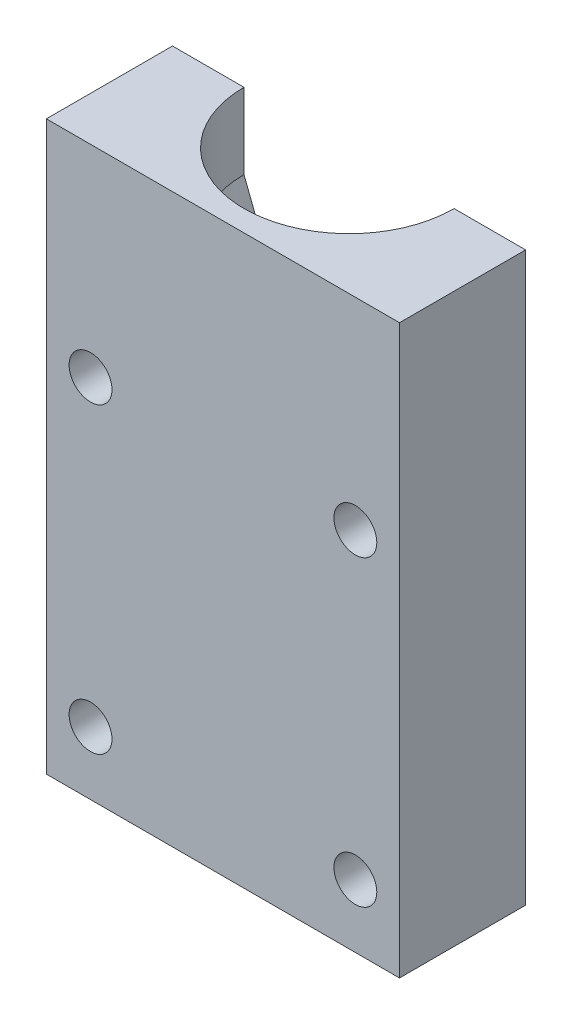
ISO-10303-21;
HEADER;
FILE_DESCRIPTION(('STEP AP214'),'2;1');
FILE_NAME('part.step','',(''),(''),'','','');
FILE_SCHEMA(('AUTOMOTIVE_DESIGN { 1 0 10303 214 1 1 1 1 }'));
ENDSEC;
DATA;
#1=APPLICATION_CONTEXT('core data for automotive mechanical design processes');
#2=APPLICATION_PROTOCOL_DEFINITION('international standard','automotive_design',2000,#1);
#3=PRODUCT_CONTEXT('',#1,'mechanical');
#4=PRODUCT('Part','Part','',(#3));
#5=PRODUCT_RELATED_PRODUCT_CATEGORY('part','',(#4));
#6=PRODUCT_DEFINITION_FORMATION('','',#4);
#7=PRODUCT_DEFINITION_CONTEXT('part definition',#1,'design');
#8=PRODUCT_DEFINITION('design','',#6,#7);
#9=PRODUCT_DEFINITION_SHAPE('','',#8);
#10=(LENGTH_UNIT() NAMED_UNIT(*) SI_UNIT(.MILLI.,.METRE.));
#11=(NAMED_UNIT(*) PLANE_ANGLE_UNIT() SI_UNIT($,.RADIAN.));
#12=(NAMED_UNIT(*) SI_UNIT($,.STERADIAN.) SOLID_ANGLE_UNIT());
#13=UNCERTAINTY_MEASURE_WITH_UNIT(LENGTH_MEASURE(1.E-05),#10,'distance_accuracy_value','');
#14=(GEOMETRIC_REPRESENTATION_CONTEXT(3) GLOBAL_UNCERTAINTY_ASSIGNED_CONTEXT((#13)) GLOBAL_UNIT_ASSIGNED_CONTEXT((#10,
#11,#12)) REPRESENTATION_CONTEXT('',''));
#15=CARTESIAN_POINT('',(0.,0.,0.));
#16=DIRECTION('',(0.,0.,1.));
#17=DIRECTION('',(1.,0.,0.));
#18=AXIS2_PLACEMENT_3D('',#15,#16,#17);
#19=CARTESIAN_POINT('',(0.,0.,0.));
#20=DIRECTION('',(0.,0.,1.));
#21=DIRECTION('',(1.,0.,0.));
#22=AXIS2_PLACEMENT_3D('',#19,#20,#21);
#23=PLANE('',#22);
#24=CARTESIAN_POINT('',(-10.5,-17.5,0.));
#25=DIRECTION('',(0.,0.,1.));
#26=DIRECTION('',(1.,0.,0.));
#27=AXIS2_PLACEMENT_3D('',#24,#25,#26);
#28=CIRCLE('',#27,1.7);
#29=CARTESIAN_POINT('',(-8.8,-17.5,0.));
#30=VERTEX_POINT('',#29);
#31=EDGE_CURVE('E197',#30,#30,#28,.T.);
#32=ORIENTED_EDGE('',*,*,#31,.T.);
#33=EDGE_LOOP('',(#32));
#34=FACE_BOUND('',#33,.T.);
#35=CARTESIAN_POINT('',(-10.5,6.5,0.));
#36=DIRECTION('',(0.,0.,1.));
#37=DIRECTION('',(1.,0.,0.));
#38=AXIS2_PLACEMENT_3D('',#35,#36,#37);
#39=CIRCLE('',#38,1.7);
#40=CARTESIAN_POINT('',(-8.8,6.5,0.));
#41=VERTEX_POINT('',#40);
#42=EDGE_CURVE('E126',#41,#41,#39,.T.);
#43=ORIENTED_EDGE('',*,*,#42,.T.);
#44=EDGE_LOOP('',(#43));
#45=FACE_BOUND('',#44,.T.);
#46=DIRECTION('',(-1.,0.,0.));
#47=VECTOR('',#46,1.);
#48=CARTESIAN_POINT('',(-14.,22.5,0.));
#49=LINE('',#48,#47);
#50=CARTESIAN_POINT('',(-8.33,22.5,0.));
#51=VERTEX_POINT('',#50);
#52=CARTESIAN_POINT('',(-14.,22.5,0.));
#53=VERTEX_POINT('',#52);
#54=EDGE_CURVE('E183',#51,#53,#49,.T.);
#55=ORIENTED_EDGE('',*,*,#54,.F.);
#56=DIRECTION('',(0.,-1.,0.));
#57=VECTOR('',#56,1.);
#58=CARTESIAN_POINT('',(-8.33,0.,0.));
#59=LINE('',#58,#57);
#60=CARTESIAN_POINT('',(-8.33,16.5,0.));
#61=VERTEX_POINT('',#60);
#62=EDGE_CURVE('E11',#51,#61,#59,.T.);
#63=ORIENTED_EDGE('',*,*,#62,.T.);
#64=DIRECTION('',(0.361996373599852,-0.932179502832237,0.));
#65=VECTOR('',#64,1.);
#66=CARTESIAN_POINT('',(0.,-4.95064377682404,0.));
#67=LINE('',#66,#65);
#68=CARTESIAN_POINT('',(-6.,10.5,0.));
#69=VERTEX_POINT('',#68);
#70=EDGE_CURVE('E41',#61,#69,#67,.T.);
#71=ORIENTED_EDGE('',*,*,#70,.T.);
#72=DIRECTION('',(0.0427544338898444,-0.999085611137884,0.));
#73=VECTOR('',#72,1.);
#74=CARTESIAN_POINT('',(0.,-129.708,0.));
#75=LINE('',#74,#73);
#76=CARTESIAN_POINT('',(-4.75,-18.71,0.));
#77=VERTEX_POINT('',#76);
#78=EDGE_CURVE('E156',#69,#77,#75,.T.);
#79=ORIENTED_EDGE('',*,*,#78,.T.);
#80=DIRECTION('',(0.,-1.,0.));
#81=VECTOR('',#80,1.);
#82=CARTESIAN_POINT('',(-4.75,0.,0.));
#83=LINE('',#82,#81);
#84=CARTESIAN_POINT('',(-4.75,-22.5,0.));
#85=VERTEX_POINT('',#84);
#86=EDGE_CURVE('E154',#77,#85,#83,.T.);
#87=ORIENTED_EDGE('',*,*,#86,.T.);
#88=DIRECTION('',(1.,0.,0.));
#89=VECTOR('',#88,1.);
#90=CARTESIAN_POINT('',(-14.,-22.5,0.));
#91=LINE('',#90,#89);
#92=CARTESIAN_POINT('',(-14.,-22.5,0.));
#93=VERTEX_POINT('',#92);
#94=EDGE_CURVE('E125',#93,#85,#91,.T.);
#95=ORIENTED_EDGE('',*,*,#94,.F.);
#96=DIRECTION('',(0.,-1.,0.));
#97=VECTOR('',#96,1.);
#98=CARTESIAN_POINT('',(-14.,22.5,0.));
#99=LINE('',#98,#97);
#100=EDGE_CURVE('E133',#53,#93,#99,.T.);
#101=ORIENTED_EDGE('',*,*,#100,.F.);
#102=EDGE_LOOP('',(#55,#63,#71,#79,#87,#95,#101));
#103=FACE_BOUND('',#102,.T.);
#104=ADVANCED_FACE('F33',(#34,#45,#103),#23,.F.);
#105=CARTESIAN_POINT('',(14.,22.5,10.));
#106=DIRECTION('',(-1.,0.,0.));
#107=DIRECTION('',(0.,-1.,0.));
#108=AXIS2_PLACEMENT_3D('',#105,#106,#107);
#109=PLANE('',#108);
#110=DIRECTION('',(0.,1.,0.));
#111=VECTOR('',#110,1.);
#112=CARTESIAN_POINT('',(14.,22.5,0.));
#113=LINE('',#112,#111);
#114=CARTESIAN_POINT('',(14.,-22.5,0.));
#115=VERTEX_POINT('',#114);
#116=CARTESIAN_POINT('',(14.,22.5,0.));
#117=VERTEX_POINT('',#116);
#118=EDGE_CURVE('E132',#115,#117,#113,.T.);
#119=ORIENTED_EDGE('',*,*,#118,.T.);
#120=DIRECTION('',(0.,0.,-1.));
#121=VECTOR('',#120,1.);
#122=CARTESIAN_POINT('',(14.,22.5,10.));
#123=LINE('',#122,#121);
#124=CARTESIAN_POINT('',(14.,22.5,10.));
#125=VERTEX_POINT('',#124);
#126=EDGE_CURVE('E119',#125,#117,#123,.T.);
#127=ORIENTED_EDGE('',*,*,#126,.F.);
#128=DIRECTION('',(0.,1.,0.));
#129=VECTOR('',#128,1.);
#130=CARTESIAN_POINT('',(14.,22.5,10.));
#131=LINE('',#130,#129);
#132=CARTESIAN_POINT('',(14.,-22.5,10.));
#133=VERTEX_POINT('',#132);
#134=EDGE_CURVE('E135',#133,#125,#131,.T.);
#135=ORIENTED_EDGE('',*,*,#134,.F.);
#136=DIRECTION('',(0.,0.,-1.));
#137=VECTOR('',#136,1.);
#138=CARTESIAN_POINT('',(14.,-22.5,10.));
#139=LINE('',#138,#137);
#140=EDGE_CURVE('E140',#133,#115,#139,.T.);
#141=ORIENTED_EDGE('',*,*,#140,.T.);
#142=EDGE_LOOP('',(#119,#127,#135,#141));
#143=FACE_BOUND('',#142,.T.);
#144=ADVANCED_FACE('F35',(#143),#109,.F.);
#145=CARTESIAN_POINT('',(-14.,22.5,10.));
#146=DIRECTION('',(0.,-1.,0.));
#147=DIRECTION('',(0.,0.,-1.));
#148=AXIS2_PLACEMENT_3D('',#145,#146,#147);
#149=PLANE('',#148);
#150=CARTESIAN_POINT('',(8.33,22.5,0.));
#151=VERTEX_POINT('',#150);
#152=EDGE_CURVE('E136',#117,#151,#49,.T.);
#153=ORIENTED_EDGE('',*,*,#152,.T.);
#154=CARTESIAN_POINT('',(0.,22.5,0.));
#155=DIRECTION('',(0.,-1.,0.));
#156=DIRECTION('',(0.,0.,-1.));
#157=AXIS2_PLACEMENT_3D('',#154,#155,#156);
#158=CIRCLE('',#157,8.33);
#159=EDGE_CURVE('E172',#151,#51,#158,.T.);
#160=ORIENTED_EDGE('',*,*,#159,.T.);
#161=ORIENTED_EDGE('',*,*,#54,.T.);
#162=DIRECTION('',(0.,0.,-1.));
#163=VECTOR('',#162,1.);
#164=CARTESIAN_POINT('',(-14.,22.5,10.));
#165=LINE('',#164,#163);
#166=CARTESIAN_POINT('',(-14.,22.5,10.));
#167=VERTEX_POINT('',#166);
#168=EDGE_CURVE('E144',#167,#53,#165,.T.);
#169=ORIENTED_EDGE('',*,*,#168,.F.);
#170=DIRECTION('',(-1.,0.,0.));
#171=VECTOR('',#170,1.);
#172=CARTESIAN_POINT('',(-14.,22.5,10.));
#173=LINE('',#172,#171);
#174=EDGE_CURVE('E86',#125,#167,#173,.T.);
#175=ORIENTED_EDGE('',*,*,#174,.F.);
#176=ORIENTED_EDGE('',*,*,#126,.T.);
#177=EDGE_LOOP('',(#153,#160,#161,#169,#175,#176));
#178=FACE_BOUND('',#177,.T.);
#179=ADVANCED_FACE('F185',(#178),#149,.F.);
#180=CARTESIAN_POINT('',(-14.,22.5,10.));
#181=DIRECTION('',(1.,0.,0.));
#182=DIRECTION('',(0.,1.,0.));
#183=AXIS2_PLACEMENT_3D('',#180,#181,#182);
#184=PLANE('',#183);
#185=ORIENTED_EDGE('',*,*,#100,.T.);
#186=DIRECTION('',(0.,0.,-1.));
#187=VECTOR('',#186,1.);
#188=CARTESIAN_POINT('',(-14.,-22.5,10.));
#189=LINE('',#188,#187);
#190=CARTESIAN_POINT('',(-14.,-22.5,10.));
#191=VERTEX_POINT('',#190);
#192=EDGE_CURVE('E142',#191,#93,#189,.T.);
#193=ORIENTED_EDGE('',*,*,#192,.F.);
#194=DIRECTION('',(0.,-1.,0.));
#195=VECTOR('',#194,1.);
#196=CARTESIAN_POINT('',(-14.,22.5,10.));
#197=LINE('',#196,#195);
#198=EDGE_CURVE('E180',#167,#191,#197,.T.);
#199=ORIENTED_EDGE('',*,*,#198,.F.);
#200=ORIENTED_EDGE('',*,*,#168,.T.);
#201=EDGE_LOOP('',(#185,#193,#199,#200));
#202=FACE_BOUND('',#201,.T.);
#203=ADVANCED_FACE('F189',(#202),#184,.F.);
#204=CARTESIAN_POINT('',(-14.,-22.5,10.));
#205=DIRECTION('',(0.,1.,0.));
#206=DIRECTION('',(0.,0.,1.));
#207=AXIS2_PLACEMENT_3D('',#204,#205,#206);
#208=PLANE('',#207);
#209=ORIENTED_EDGE('',*,*,#94,.T.);
#210=CARTESIAN_POINT('',(0.,-22.5,0.));
#211=DIRECTION('',(0.,-1.,0.));
#212=DIRECTION('',(0.,0.,-1.));
#213=AXIS2_PLACEMENT_3D('',#210,#211,#212);
#214=CIRCLE('',#213,4.75);
#215=CARTESIAN_POINT('',(4.75,-22.5,0.));
#216=VERTEX_POINT('',#215);
#217=EDGE_CURVE('E114',#216,#85,#214,.T.);
#218=ORIENTED_EDGE('',*,*,#217,.F.);
#219=EDGE_CURVE('E78',#216,#115,#91,.T.);
#220=ORIENTED_EDGE('',*,*,#219,.T.);
#221=ORIENTED_EDGE('',*,*,#140,.F.);
#222=DIRECTION('',(1.,0.,0.));
#223=VECTOR('',#222,1.);
#224=CARTESIAN_POINT('',(-14.,-22.5,10.));
#225=LINE('',#224,#223);
#226=EDGE_CURVE('E57',#191,#133,#225,.T.);
#227=ORIENTED_EDGE('',*,*,#226,.F.);
#228=ORIENTED_EDGE('',*,*,#192,.T.);
#229=EDGE_LOOP('',(#209,#218,#220,#221,#227,#228));
#230=FACE_BOUND('',#229,.T.);
#231=ADVANCED_FACE('F122',(#230),#208,.F.);
#232=CARTESIAN_POINT('',(0.,0.,10.));
#233=DIRECTION('',(0.,0.,1.));
#234=DIRECTION('',(1.,0.,0.));
#235=AXIS2_PLACEMENT_3D('',#232,#233,#234);
#236=PLANE('',#235);
#237=CARTESIAN_POINT('',(-10.5,-17.5,10.));
#238=DIRECTION('',(0.,0.,1.));
#239=DIRECTION('',(1.,0.,0.));
#240=AXIS2_PLACEMENT_3D('',#237,#238,#239);
#241=CIRCLE('',#240,1.7);
#242=CARTESIAN_POINT('',(-8.8,-17.5,10.));
#243=VERTEX_POINT('',#242);
#244=EDGE_CURVE('E207',#243,#243,#241,.T.);
#245=ORIENTED_EDGE('',*,*,#244,.F.);
#246=EDGE_LOOP('',(#245));
#247=FACE_BOUND('',#246,.T.);
#248=CARTESIAN_POINT('',(10.5,6.5,10.));
#249=DIRECTION('',(0.,0.,1.));
#250=DIRECTION('',(1.,0.,0.));
#251=AXIS2_PLACEMENT_3D('',#248,#249,#250);
#252=CIRCLE('',#251,1.7);
#253=CARTESIAN_POINT('',(12.2,6.5,10.));
#254=VERTEX_POINT('',#253);
#255=EDGE_CURVE('E200',#254,#254,#252,.T.);
#256=ORIENTED_EDGE('',*,*,#255,.F.);
#257=EDGE_LOOP('',(#256));
#258=FACE_BOUND('',#257,.T.);
#259=CARTESIAN_POINT('',(10.5,-17.5,10.));
#260=DIRECTION('',(0.,0.,1.));
#261=DIRECTION('',(1.,0.,0.));
#262=AXIS2_PLACEMENT_3D('',#259,#260,#261);
#263=CIRCLE('',#262,1.7);
#264=CARTESIAN_POINT('',(12.2,-17.5,10.));
#265=VERTEX_POINT('',#264);
#266=EDGE_CURVE('E212',#265,#265,#263,.T.);
#267=ORIENTED_EDGE('',*,*,#266,.F.);
#268=EDGE_LOOP('',(#267));
#269=FACE_BOUND('',#268,.T.);
#270=CARTESIAN_POINT('',(-10.5,6.5,10.));
#271=DIRECTION('',(0.,0.,1.));
#272=DIRECTION('',(1.,0.,0.));
#273=AXIS2_PLACEMENT_3D('',#270,#271,#272);
#274=CIRCLE('',#273,1.7);
#275=CARTESIAN_POINT('',(-8.8,6.5,10.));
#276=VERTEX_POINT('',#275);
#277=EDGE_CURVE('E194',#276,#276,#274,.T.);
#278=ORIENTED_EDGE('',*,*,#277,.F.);
#279=EDGE_LOOP('',(#278));
#280=FACE_BOUND('',#279,.T.);
#281=ORIENTED_EDGE('',*,*,#134,.T.);
#282=ORIENTED_EDGE('',*,*,#174,.T.);
#283=ORIENTED_EDGE('',*,*,#198,.T.);
#284=ORIENTED_EDGE('',*,*,#226,.T.);
#285=EDGE_LOOP('',(#281,#282,#283,#284));
#286=FACE_BOUND('',#285,.T.);
#287=ADVANCED_FACE('F226',(#247,#258,#269,#280,#286),#236,.T.);
#288=CARTESIAN_POINT('',(10.5,6.5,0.));
#289=DIRECTION('',(0.,0.,1.));
#290=DIRECTION('',(1.,0.,0.));
#291=AXIS2_PLACEMENT_3D('',#288,#289,#290);
#292=CIRCLE('',#291,1.7);
#293=CARTESIAN_POINT('',(12.2,6.5,0.));
#294=VERTEX_POINT('',#293);
#295=EDGE_CURVE('E203',#294,#294,#292,.T.);
#296=ORIENTED_EDGE('',*,*,#295,.T.);
#297=EDGE_LOOP('',(#296));
#298=FACE_BOUND('',#297,.T.);
#299=CARTESIAN_POINT('',(10.5,-17.5,0.));
#300=DIRECTION('',(0.,0.,1.));
#301=DIRECTION('',(1.,0.,0.));
#302=AXIS2_PLACEMENT_3D('',#299,#300,#301);
#303=CIRCLE('',#302,1.7);
#304=CARTESIAN_POINT('',(12.2,-17.5,0.));
#305=VERTEX_POINT('',#304);
#306=EDGE_CURVE('E204',#305,#305,#303,.T.);
#307=ORIENTED_EDGE('',*,*,#306,.T.);
#308=EDGE_LOOP('',(#307));
#309=FACE_BOUND('',#308,.T.);
#310=DIRECTION('',(0.361996373599852,0.932179502832237,0.));
#311=VECTOR('',#310,1.);
#312=CARTESIAN_POINT('',(0.,-4.95064377682404,0.));
#313=LINE('',#312,#311);
#314=CARTESIAN_POINT('',(6.,10.5,0.));
#315=VERTEX_POINT('',#314);
#316=CARTESIAN_POINT('',(8.33,16.5,0.));
#317=VERTEX_POINT('',#316);
#318=EDGE_CURVE('E149',#315,#317,#313,.T.);
#319=ORIENTED_EDGE('',*,*,#318,.T.);
#320=DIRECTION('',(0.,-1.,0.));
#321=VECTOR('',#320,1.);
#322=CARTESIAN_POINT('',(8.33,0.,0.));
#323=LINE('',#322,#321);
#324=EDGE_CURVE('E151',#317,#151,#323,.F.);
#325=ORIENTED_EDGE('',*,*,#324,.T.);
#326=ORIENTED_EDGE('',*,*,#152,.F.);
#327=ORIENTED_EDGE('',*,*,#118,.F.);
#328=ORIENTED_EDGE('',*,*,#219,.F.);
#329=DIRECTION('',(0.,-1.,0.));
#330=VECTOR('',#329,1.);
#331=CARTESIAN_POINT('',(4.75,0.,0.));
#332=LINE('',#331,#330);
#333=CARTESIAN_POINT('',(4.75,-18.71,0.));
#334=VERTEX_POINT('',#333);
#335=EDGE_CURVE('E112',#216,#334,#332,.F.);
#336=ORIENTED_EDGE('',*,*,#335,.T.);
#337=DIRECTION('',(0.0427544338898444,0.999085611137884,0.));
#338=VECTOR('',#337,1.);
#339=CARTESIAN_POINT('',(0.,-129.708,0.));
#340=LINE('',#339,#338);
#341=EDGE_CURVE('E118',#334,#315,#340,.T.);
#342=ORIENTED_EDGE('',*,*,#341,.T.);
#343=EDGE_LOOP('',(#319,#325,#326,#327,#328,#336,#342));
#344=FACE_BOUND('',#343,.T.);
#345=ADVANCED_FACE('F130',(#298,#309,#344),#23,.F.);
#346=CARTESIAN_POINT('',(0.,0.,0.));
#347=DIRECTION('',(0.,-1.,0.));
#348=DIRECTION('',(0.,0.,-1.));
#349=AXIS2_PLACEMENT_3D('',#346,#347,#348);
#350=CYLINDRICAL_SURFACE('',#349,8.33);
#351=ORIENTED_EDGE('',*,*,#159,.F.);
#352=ORIENTED_EDGE('',*,*,#324,.F.);
#353=CARTESIAN_POINT('',(0.,16.5,0.));
#354=DIRECTION('',(0.,-1.,0.));
#355=DIRECTION('',(0.,0.,-1.));
#356=AXIS2_PLACEMENT_3D('',#353,#354,#355);
#357=CIRCLE('',#356,8.33);
#358=EDGE_CURVE('E166',#317,#61,#357,.T.);
#359=ORIENTED_EDGE('',*,*,#358,.T.);
#360=ORIENTED_EDGE('',*,*,#62,.F.);
#361=EDGE_LOOP('',(#351,#352,#359,#360));
#362=FACE_BOUND('',#361,.T.);
#363=ADVANCED_FACE('F170',(#362),#350,.F.);
#364=CARTESIAN_POINT('',(0.,10.5,0.));
#365=DIRECTION('',(0.,1.,0.));
#366=DIRECTION('',(0.,0.,1.));
#367=AXIS2_PLACEMENT_3D('',#364,#365,#366);
#368=CONICAL_SURFACE('',#367,6.,0.370408624543169);
#369=CARTESIAN_POINT('',(0.,10.5,0.));
#370=DIRECTION('',(0.,-1.,0.));
#371=DIRECTION('',(0.,0.,-1.));
#372=AXIS2_PLACEMENT_3D('',#369,#370,#371);
#373=CIRCLE('',#372,6.);
#374=EDGE_CURVE('E168',#315,#69,#373,.T.);
#375=ORIENTED_EDGE('',*,*,#374,.T.);
#376=ORIENTED_EDGE('',*,*,#70,.F.);
#377=ORIENTED_EDGE('',*,*,#358,.F.);
#378=ORIENTED_EDGE('',*,*,#318,.F.);
#379=EDGE_LOOP('',(#375,#376,#377,#378));
#380=FACE_BOUND('',#379,.T.);
#381=ADVANCED_FACE('F165',(#380),#368,.F.);
#382=CARTESIAN_POINT('',(0.,-18.71,0.));
#383=DIRECTION('',(0.,1.,0.));
#384=DIRECTION('',(0.,0.,1.));
#385=AXIS2_PLACEMENT_3D('',#382,#383,#384);
#386=CONICAL_SURFACE('',#385,4.75,0.0427674700507354);
#387=CARTESIAN_POINT('',(0.,-18.71,0.));
#388=DIRECTION('',(0.,-1.,0.));
#389=DIRECTION('',(0.,0.,-1.));
#390=AXIS2_PLACEMENT_3D('',#387,#388,#389);
#391=CIRCLE('',#390,4.75);
#392=EDGE_CURVE('E48',#334,#77,#391,.T.);
#393=ORIENTED_EDGE('',*,*,#392,.T.);
#394=ORIENTED_EDGE('',*,*,#78,.F.);
#395=ORIENTED_EDGE('',*,*,#374,.F.);
#396=ORIENTED_EDGE('',*,*,#341,.F.);
#397=EDGE_LOOP('',(#393,#394,#395,#396));
#398=FACE_BOUND('',#397,.T.);
#399=ADVANCED_FACE('F192',(#398),#386,.F.);
#400=CARTESIAN_POINT('',(0.,0.,0.));
#401=DIRECTION('',(0.,-1.,0.));
#402=DIRECTION('',(0.,0.,-1.));
#403=AXIS2_PLACEMENT_3D('',#400,#401,#402);
#404=CYLINDRICAL_SURFACE('',#403,4.75);
#405=ORIENTED_EDGE('',*,*,#392,.F.);
#406=ORIENTED_EDGE('',*,*,#335,.F.);
#407=ORIENTED_EDGE('',*,*,#217,.T.);
#408=ORIENTED_EDGE('',*,*,#86,.F.);
#409=EDGE_LOOP('',(#405,#406,#407,#408));
#410=FACE_BOUND('',#409,.T.);
#411=ADVANCED_FACE('F113',(#410),#404,.F.);
#412=CARTESIAN_POINT('',(10.5,-17.5,0.));
#413=DIRECTION('',(0.,0.,1.));
#414=DIRECTION('',(1.,0.,0.));
#415=AXIS2_PLACEMENT_3D('',#412,#413,#414);
#416=CYLINDRICAL_SURFACE('',#415,1.7);
#417=ORIENTED_EDGE('',*,*,#306,.F.);
#418=EDGE_LOOP('',(#417));
#419=FACE_BOUND('',#418,.T.);
#420=ORIENTED_EDGE('',*,*,#266,.T.);
#421=EDGE_LOOP('',(#420));
#422=FACE_BOUND('',#421,.T.);
#423=ADVANCED_FACE('F219',(#419,#422),#416,.F.);
#424=CARTESIAN_POINT('',(10.5,6.5,0.));
#425=DIRECTION('',(0.,0.,1.));
#426=DIRECTION('',(1.,0.,0.));
#427=AXIS2_PLACEMENT_3D('',#424,#425,#426);
#428=CYLINDRICAL_SURFACE('',#427,1.7);
#429=ORIENTED_EDGE('',*,*,#295,.F.);
#430=EDGE_LOOP('',(#429));
#431=FACE_BOUND('',#430,.T.);
#432=ORIENTED_EDGE('',*,*,#255,.T.);
#433=EDGE_LOOP('',(#432));
#434=FACE_BOUND('',#433,.T.);
#435=ADVANCED_FACE('F222',(#431,#434),#428,.F.);
#436=CARTESIAN_POINT('',(-10.5,6.5,0.));
#437=DIRECTION('',(0.,0.,1.));
#438=DIRECTION('',(1.,0.,0.));
#439=AXIS2_PLACEMENT_3D('',#436,#437,#438);
#440=CYLINDRICAL_SURFACE('',#439,1.7);
#441=ORIENTED_EDGE('',*,*,#42,.F.);
#442=EDGE_LOOP('',(#441));
#443=FACE_BOUND('',#442,.T.);
#444=ORIENTED_EDGE('',*,*,#277,.T.);
#445=EDGE_LOOP('',(#444));
#446=FACE_BOUND('',#445,.T.);
#447=ADVANCED_FACE('F256',(#443,#446),#440,.F.);
#448=CARTESIAN_POINT('',(-10.5,-17.5,0.));
#449=DIRECTION('',(0.,0.,1.));
#450=DIRECTION('',(1.,0.,0.));
#451=AXIS2_PLACEMENT_3D('',#448,#449,#450);
#452=CYLINDRICAL_SURFACE('',#451,1.7);
#453=ORIENTED_EDGE('',*,*,#31,.F.);
#454=EDGE_LOOP('',(#453));
#455=FACE_BOUND('',#454,.T.);
#456=ORIENTED_EDGE('',*,*,#244,.T.);
#457=EDGE_LOOP('',(#456));
#458=FACE_BOUND('',#457,.T.);
#459=ADVANCED_FACE('F263',(#455,#458),#452,.F.);
#460=CLOSED_SHELL('',(#104,#144,#179,#203,#231,#287,#345,#363,#381,#399,#411,#423,#435,#447,#459));
#461=MANIFOLD_SOLID_BREP('B2',#460);
#462=ADVANCED_BREP_SHAPE_REPRESENTATION('',(#18,#461),#14);
#463=SHAPE_DEFINITION_REPRESENTATION(#9,#462);
ENDSEC;
END-ISO-10303-21;
